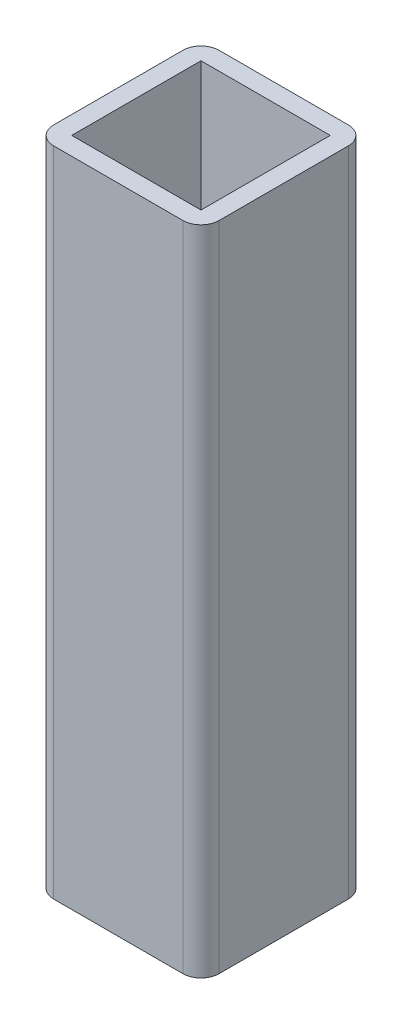
ISO-10303-21;
HEADER;
FILE_DESCRIPTION(('STEP AP214'),'2;1');
FILE_NAME('part.step','',(''),(''),'','','');
FILE_SCHEMA(('AUTOMOTIVE_DESIGN { 1 0 10303 214 1 1 1 1 }'));
ENDSEC;
DATA;
#1=APPLICATION_CONTEXT('core data for automotive mechanical design processes');
#2=APPLICATION_PROTOCOL_DEFINITION('international standard','automotive_design',2000,#1);
#3=PRODUCT_CONTEXT('',#1,'mechanical');
#4=PRODUCT('Part','Part','',(#3));
#5=PRODUCT_RELATED_PRODUCT_CATEGORY('part','',(#4));
#6=PRODUCT_DEFINITION_FORMATION('','',#4);
#7=PRODUCT_DEFINITION_CONTEXT('part definition',#1,'design');
#8=PRODUCT_DEFINITION('design','',#6,#7);
#9=PRODUCT_DEFINITION_SHAPE('','',#8);
#10=(LENGTH_UNIT() NAMED_UNIT(*) SI_UNIT(.MILLI.,.METRE.));
#11=(NAMED_UNIT(*) PLANE_ANGLE_UNIT() SI_UNIT($,.RADIAN.));
#12=(NAMED_UNIT(*) SI_UNIT($,.STERADIAN.) SOLID_ANGLE_UNIT());
#13=UNCERTAINTY_MEASURE_WITH_UNIT(LENGTH_MEASURE(1.E-05),#10,'distance_accuracy_value','');
#14=(GEOMETRIC_REPRESENTATION_CONTEXT(3) GLOBAL_UNCERTAINTY_ASSIGNED_CONTEXT((#13)) GLOBAL_UNIT_ASSIGNED_CONTEXT((#10,
#11,#12)) REPRESENTATION_CONTEXT('',''));
#15=CARTESIAN_POINT('',(0.,0.,0.));
#16=DIRECTION('',(0.,0.,1.));
#17=DIRECTION('',(1.,0.,0.));
#18=AXIS2_PLACEMENT_3D('',#15,#16,#17);
#19=CARTESIAN_POINT('',(22.8,100.91,2.8));
#20=DIRECTION('',(0.,-1.,0.));
#21=DIRECTION('',(0.,0.,-1.));
#22=AXIS2_PLACEMENT_3D('',#19,#20,#21);
#23=CYLINDRICAL_SURFACE('',#22,2.8);
#24=CARTESIAN_POINT('',(22.8,0.,2.8));
#25=DIRECTION('',(0.,1.,0.));
#26=DIRECTION('',(0.,0.,-1.));
#27=AXIS2_PLACEMENT_3D('',#24,#25,#26);
#28=CIRCLE('',#27,2.8);
#29=CARTESIAN_POINT('',(25.6,0.,2.80000000000002));
#30=VERTEX_POINT('',#29);
#31=CARTESIAN_POINT('',(22.8,0.,0.));
#32=VERTEX_POINT('',#31);
#33=EDGE_CURVE('E157',#30,#32,#28,.T.);
#34=ORIENTED_EDGE('',*,*,#33,.T.);
#35=DIRECTION('',(0.,-1.,0.));
#36=VECTOR('',#35,1.);
#37=CARTESIAN_POINT('',(22.8,100.91,0.));
#38=LINE('',#37,#36);
#39=CARTESIAN_POINT('',(22.8,100.91,0.));
#40=VERTEX_POINT('',#39);
#41=EDGE_CURVE('E11',#40,#32,#38,.T.);
#42=ORIENTED_EDGE('',*,*,#41,.F.);
#43=CARTESIAN_POINT('',(22.8,100.91,2.8));
#44=DIRECTION('',(0.,1.,0.));
#45=DIRECTION('',(0.,0.,-1.));
#46=AXIS2_PLACEMENT_3D('',#43,#44,#45);
#47=CIRCLE('',#46,2.8);
#48=CARTESIAN_POINT('',(25.6,100.91,2.80000000000002));
#49=VERTEX_POINT('',#48);
#50=EDGE_CURVE('E158',#49,#40,#47,.T.);
#51=ORIENTED_EDGE('',*,*,#50,.F.);
#52=DIRECTION('',(0.,-1.,0.));
#53=VECTOR('',#52,1.);
#54=CARTESIAN_POINT('',(25.6,100.91,2.80000000000002));
#55=LINE('',#54,#53);
#56=EDGE_CURVE('E176',#49,#30,#55,.T.);
#57=ORIENTED_EDGE('',*,*,#56,.T.);
#58=EDGE_LOOP('',(#34,#42,#51,#57));
#59=FACE_BOUND('',#58,.T.);
#60=ADVANCED_FACE('F32',(#59),#23,.T.);
#61=CARTESIAN_POINT('',(2.80000000000002,100.91,0.));
#62=DIRECTION('',(0.,0.,1.));
#63=DIRECTION('',(1.,0.,0.));
#64=AXIS2_PLACEMENT_3D('',#61,#62,#63);
#65=PLANE('',#64);
#66=DIRECTION('',(-1.,0.,0.));
#67=VECTOR('',#66,1.);
#68=CARTESIAN_POINT('',(2.80000000000002,0.,0.));
#69=LINE('',#68,#67);
#70=CARTESIAN_POINT('',(2.80000000000002,0.,0.));
#71=VERTEX_POINT('',#70);
#72=EDGE_CURVE('E179',#32,#71,#69,.T.);
#73=ORIENTED_EDGE('',*,*,#72,.T.);
#74=DIRECTION('',(0.,-1.,0.));
#75=VECTOR('',#74,1.);
#76=CARTESIAN_POINT('',(2.80000000000002,100.91,0.));
#77=LINE('',#76,#75);
#78=CARTESIAN_POINT('',(2.80000000000002,100.91,0.));
#79=VERTEX_POINT('',#78);
#80=EDGE_CURVE('E39',#79,#71,#77,.T.);
#81=ORIENTED_EDGE('',*,*,#80,.F.);
#82=DIRECTION('',(-1.,0.,0.));
#83=VECTOR('',#82,1.);
#84=CARTESIAN_POINT('',(2.80000000000002,100.91,0.));
#85=LINE('',#84,#83);
#86=EDGE_CURVE('E161',#40,#79,#85,.T.);
#87=ORIENTED_EDGE('',*,*,#86,.F.);
#88=ORIENTED_EDGE('',*,*,#41,.T.);
#89=EDGE_LOOP('',(#73,#81,#87,#88));
#90=FACE_BOUND('',#89,.T.);
#91=ADVANCED_FACE('F234',(#90),#65,.F.);
#92=CARTESIAN_POINT('',(2.8,100.91,2.8));
#93=DIRECTION('',(0.,-1.,0.));
#94=DIRECTION('',(0.,0.,-1.));
#95=AXIS2_PLACEMENT_3D('',#92,#93,#94);
#96=CYLINDRICAL_SURFACE('',#95,2.8);
#97=CARTESIAN_POINT('',(2.8,0.,2.8));
#98=DIRECTION('',(0.,1.,0.));
#99=DIRECTION('',(0.,0.,1.));
#100=AXIS2_PLACEMENT_3D('',#97,#98,#99);
#101=CIRCLE('',#100,2.8);
#102=CARTESIAN_POINT('',(0.,0.,2.80000000000002));
#103=VERTEX_POINT('',#102);
#104=EDGE_CURVE('E181',#71,#103,#101,.T.);
#105=ORIENTED_EDGE('',*,*,#104,.T.);
#106=DIRECTION('',(0.,-1.,0.));
#107=VECTOR('',#106,1.);
#108=CARTESIAN_POINT('',(0.,100.91,2.80000000000002));
#109=LINE('',#108,#107);
#110=CARTESIAN_POINT('',(0.,100.91,2.80000000000002));
#111=VERTEX_POINT('',#110);
#112=EDGE_CURVE('E206',#111,#103,#109,.T.);
#113=ORIENTED_EDGE('',*,*,#112,.F.);
#114=CARTESIAN_POINT('',(2.8,100.91,2.8));
#115=DIRECTION('',(0.,1.,0.));
#116=DIRECTION('',(0.,0.,1.));
#117=AXIS2_PLACEMENT_3D('',#114,#115,#116);
#118=CIRCLE('',#117,2.8);
#119=EDGE_CURVE('E164',#79,#111,#118,.T.);
#120=ORIENTED_EDGE('',*,*,#119,.F.);
#121=ORIENTED_EDGE('',*,*,#80,.T.);
#122=EDGE_LOOP('',(#105,#113,#120,#121));
#123=FACE_BOUND('',#122,.T.);
#124=ADVANCED_FACE('F213',(#123),#96,.T.);
#125=CARTESIAN_POINT('',(0.,100.91,2.80000000000002));
#126=DIRECTION('',(1.,0.,0.));
#127=DIRECTION('',(0.,0.,-1.));
#128=AXIS2_PLACEMENT_3D('',#125,#126,#127);
#129=PLANE('',#128);
#130=DIRECTION('',(0.,0.,1.));
#131=VECTOR('',#130,1.);
#132=CARTESIAN_POINT('',(0.,0.,2.80000000000002));
#133=LINE('',#132,#131);
#134=CARTESIAN_POINT('',(0.,0.,22.8));
#135=VERTEX_POINT('',#134);
#136=EDGE_CURVE('E183',#103,#135,#133,.T.);
#137=ORIENTED_EDGE('',*,*,#136,.T.);
#138=DIRECTION('',(0.,-1.,0.));
#139=VECTOR('',#138,1.);
#140=CARTESIAN_POINT('',(0.,100.91,22.8));
#141=LINE('',#140,#139);
#142=CARTESIAN_POINT('',(0.,100.91,22.8));
#143=VERTEX_POINT('',#142);
#144=EDGE_CURVE('E203',#143,#135,#141,.T.);
#145=ORIENTED_EDGE('',*,*,#144,.F.);
#146=DIRECTION('',(0.,0.,1.));
#147=VECTOR('',#146,1.);
#148=CARTESIAN_POINT('',(0.,100.91,2.80000000000002));
#149=LINE('',#148,#147);
#150=EDGE_CURVE('E166',#111,#143,#149,.T.);
#151=ORIENTED_EDGE('',*,*,#150,.F.);
#152=ORIENTED_EDGE('',*,*,#112,.T.);
#153=EDGE_LOOP('',(#137,#145,#151,#152));
#154=FACE_BOUND('',#153,.T.);
#155=ADVANCED_FACE('F222',(#154),#129,.F.);
#156=CARTESIAN_POINT('',(2.8,100.91,22.8));
#157=DIRECTION('',(0.,-1.,0.));
#158=DIRECTION('',(0.,0.,-1.));
#159=AXIS2_PLACEMENT_3D('',#156,#157,#158);
#160=CYLINDRICAL_SURFACE('',#159,2.8);
#161=CARTESIAN_POINT('',(2.8,0.,22.8));
#162=DIRECTION('',(0.,1.,0.));
#163=DIRECTION('',(0.,0.,1.));
#164=AXIS2_PLACEMENT_3D('',#161,#162,#163);
#165=CIRCLE('',#164,2.8);
#166=CARTESIAN_POINT('',(2.80000000000002,0.,25.6));
#167=VERTEX_POINT('',#166);
#168=EDGE_CURVE('E185',#135,#167,#165,.T.);
#169=ORIENTED_EDGE('',*,*,#168,.T.);
#170=DIRECTION('',(0.,-1.,0.));
#171=VECTOR('',#170,1.);
#172=CARTESIAN_POINT('',(2.80000000000002,100.91,25.6));
#173=LINE('',#172,#171);
#174=CARTESIAN_POINT('',(2.80000000000002,100.91,25.6));
#175=VERTEX_POINT('',#174);
#176=EDGE_CURVE('E200',#175,#167,#173,.T.);
#177=ORIENTED_EDGE('',*,*,#176,.F.);
#178=CARTESIAN_POINT('',(2.8,100.91,22.8));
#179=DIRECTION('',(0.,1.,0.));
#180=DIRECTION('',(0.,0.,1.));
#181=AXIS2_PLACEMENT_3D('',#178,#179,#180);
#182=CIRCLE('',#181,2.8);
#183=EDGE_CURVE('E168',#143,#175,#182,.T.);
#184=ORIENTED_EDGE('',*,*,#183,.F.);
#185=ORIENTED_EDGE('',*,*,#144,.T.);
#186=EDGE_LOOP('',(#169,#177,#184,#185));
#187=FACE_BOUND('',#186,.T.);
#188=ADVANCED_FACE('F226',(#187),#160,.T.);
#189=CARTESIAN_POINT('',(2.80000000000002,100.91,25.6));
#190=DIRECTION('',(0.,0.,-1.));
#191=DIRECTION('',(-1.,0.,0.));
#192=AXIS2_PLACEMENT_3D('',#189,#190,#191);
#193=PLANE('',#192);
#194=DIRECTION('',(1.,0.,0.));
#195=VECTOR('',#194,1.);
#196=CARTESIAN_POINT('',(2.80000000000002,0.,25.6));
#197=LINE('',#196,#195);
#198=CARTESIAN_POINT('',(22.8,0.,25.6));
#199=VERTEX_POINT('',#198);
#200=EDGE_CURVE('E187',#167,#199,#197,.T.);
#201=ORIENTED_EDGE('',*,*,#200,.T.);
#202=DIRECTION('',(0.,-1.,0.));
#203=VECTOR('',#202,1.);
#204=CARTESIAN_POINT('',(22.8,100.91,25.6));
#205=LINE('',#204,#203);
#206=CARTESIAN_POINT('',(22.8,100.91,25.6));
#207=VERTEX_POINT('',#206);
#208=EDGE_CURVE('E197',#207,#199,#205,.T.);
#209=ORIENTED_EDGE('',*,*,#208,.F.);
#210=DIRECTION('',(1.,0.,0.));
#211=VECTOR('',#210,1.);
#212=CARTESIAN_POINT('',(2.80000000000002,100.91,25.6));
#213=LINE('',#212,#211);
#214=EDGE_CURVE('E170',#175,#207,#213,.T.);
#215=ORIENTED_EDGE('',*,*,#214,.F.);
#216=ORIENTED_EDGE('',*,*,#176,.T.);
#217=EDGE_LOOP('',(#201,#209,#215,#216));
#218=FACE_BOUND('',#217,.T.);
#219=ADVANCED_FACE('F247',(#218),#193,.F.);
#220=CARTESIAN_POINT('',(22.8,100.91,22.8));
#221=DIRECTION('',(0.,-1.,0.));
#222=DIRECTION('',(0.,0.,-1.));
#223=AXIS2_PLACEMENT_3D('',#220,#221,#222);
#224=CYLINDRICAL_SURFACE('',#223,2.8);
#225=CARTESIAN_POINT('',(22.8,0.,22.8));
#226=DIRECTION('',(0.,1.,0.));
#227=DIRECTION('',(0.,0.,1.));
#228=AXIS2_PLACEMENT_3D('',#225,#226,#227);
#229=CIRCLE('',#228,2.8);
#230=CARTESIAN_POINT('',(25.6,0.,22.8));
#231=VERTEX_POINT('',#230);
#232=EDGE_CURVE('E189',#199,#231,#229,.T.);
#233=ORIENTED_EDGE('',*,*,#232,.T.);
#234=DIRECTION('',(0.,-1.,0.));
#235=VECTOR('',#234,1.);
#236=CARTESIAN_POINT('',(25.6,100.91,22.8));
#237=LINE('',#236,#235);
#238=CARTESIAN_POINT('',(25.6,100.91,22.8));
#239=VERTEX_POINT('',#238);
#240=EDGE_CURVE('E194',#239,#231,#237,.T.);
#241=ORIENTED_EDGE('',*,*,#240,.F.);
#242=CARTESIAN_POINT('',(22.8,100.91,22.8));
#243=DIRECTION('',(0.,1.,0.));
#244=DIRECTION('',(0.,0.,1.));
#245=AXIS2_PLACEMENT_3D('',#242,#243,#244);
#246=CIRCLE('',#245,2.8);
#247=EDGE_CURVE('E172',#207,#239,#246,.T.);
#248=ORIENTED_EDGE('',*,*,#247,.F.);
#249=ORIENTED_EDGE('',*,*,#208,.T.);
#250=EDGE_LOOP('',(#233,#241,#248,#249));
#251=FACE_BOUND('',#250,.T.);
#252=ADVANCED_FACE('F245',(#251),#224,.T.);
#253=CARTESIAN_POINT('',(25.6,100.91,2.80000000000002));
#254=DIRECTION('',(-1.,0.,0.));
#255=DIRECTION('',(0.,0.,1.));
#256=AXIS2_PLACEMENT_3D('',#253,#254,#255);
#257=PLANE('',#256);
#258=DIRECTION('',(0.,0.,-1.));
#259=VECTOR('',#258,1.);
#260=CARTESIAN_POINT('',(25.6,0.,2.80000000000002));
#261=LINE('',#260,#259);
#262=EDGE_CURVE('E162',#231,#30,#261,.T.);
#263=ORIENTED_EDGE('',*,*,#262,.T.);
#264=ORIENTED_EDGE('',*,*,#56,.F.);
#265=DIRECTION('',(0.,0.,-1.));
#266=VECTOR('',#265,1.);
#267=CARTESIAN_POINT('',(25.6,100.91,2.80000000000002));
#268=LINE('',#267,#266);
#269=EDGE_CURVE('E174',#239,#49,#268,.T.);
#270=ORIENTED_EDGE('',*,*,#269,.F.);
#271=ORIENTED_EDGE('',*,*,#240,.T.);
#272=EDGE_LOOP('',(#263,#264,#270,#271));
#273=FACE_BOUND('',#272,.T.);
#274=ADVANCED_FACE('F240',(#273),#257,.F.);
#275=CARTESIAN_POINT('',(22.8,100.91,2.8));
#276=DIRECTION('',(0.,-1.,0.));
#277=DIRECTION('',(0.,0.,-1.));
#278=AXIS2_PLACEMENT_3D('',#275,#276,#277);
#279=PLANE('',#278);
#280=DIRECTION('',(1.,0.,0.));
#281=VECTOR('',#280,1.);
#282=CARTESIAN_POINT('',(22.8,100.91,2.8));
#283=LINE('',#282,#281);
#284=CARTESIAN_POINT('',(2.8,100.91,2.8));
#285=VERTEX_POINT('',#284);
#286=CARTESIAN_POINT('',(22.8,100.91,2.8));
#287=VERTEX_POINT('',#286);
#288=EDGE_CURVE('E151',#285,#287,#283,.T.);
#289=ORIENTED_EDGE('',*,*,#288,.T.);
#290=DIRECTION('',(0.,0.,1.));
#291=VECTOR('',#290,1.);
#292=CARTESIAN_POINT('',(22.8,100.91,2.8));
#293=LINE('',#292,#291);
#294=CARTESIAN_POINT('',(22.8,100.91,22.8));
#295=VERTEX_POINT('',#294);
#296=EDGE_CURVE('E154',#287,#295,#293,.T.);
#297=ORIENTED_EDGE('',*,*,#296,.T.);
#298=DIRECTION('',(-1.,0.,0.));
#299=VECTOR('',#298,1.);
#300=CARTESIAN_POINT('',(22.8,100.91,22.8));
#301=LINE('',#300,#299);
#302=CARTESIAN_POINT('',(2.8,100.91,22.8));
#303=VERTEX_POINT('',#302);
#304=EDGE_CURVE('E146',#295,#303,#301,.T.);
#305=ORIENTED_EDGE('',*,*,#304,.T.);
#306=DIRECTION('',(0.,0.,-1.));
#307=VECTOR('',#306,1.);
#308=CARTESIAN_POINT('',(2.8,100.91,2.79999999999999));
#309=LINE('',#308,#307);
#310=EDGE_CURVE('E126',#303,#285,#309,.T.);
#311=ORIENTED_EDGE('',*,*,#310,.T.);
#312=EDGE_LOOP('',(#289,#297,#305,#311));
#313=FACE_BOUND('',#312,.T.);
#314=ORIENTED_EDGE('',*,*,#50,.T.);
#315=ORIENTED_EDGE('',*,*,#86,.T.);
#316=ORIENTED_EDGE('',*,*,#119,.T.);
#317=ORIENTED_EDGE('',*,*,#150,.T.);
#318=ORIENTED_EDGE('',*,*,#183,.T.);
#319=ORIENTED_EDGE('',*,*,#214,.T.);
#320=ORIENTED_EDGE('',*,*,#247,.T.);
#321=ORIENTED_EDGE('',*,*,#269,.T.);
#322=EDGE_LOOP('',(#314,#315,#316,#317,#318,#319,#320,#321));
#323=FACE_BOUND('',#322,.T.);
#324=ADVANCED_FACE('F230',(#313,#323),#279,.F.);
#325=CARTESIAN_POINT('',(22.8,0.,2.8));
#326=DIRECTION('',(0.,-1.,0.));
#327=DIRECTION('',(0.,0.,-1.));
#328=AXIS2_PLACEMENT_3D('',#325,#326,#327);
#329=PLANE('',#328);
#330=DIRECTION('',(0.,0.,1.));
#331=VECTOR('',#330,1.);
#332=CARTESIAN_POINT('',(22.8,0.,2.8));
#333=LINE('',#332,#331);
#334=CARTESIAN_POINT('',(22.8,0.,2.8));
#335=VERTEX_POINT('',#334);
#336=CARTESIAN_POINT('',(22.8,0.,22.8));
#337=VERTEX_POINT('',#336);
#338=EDGE_CURVE('E54',#335,#337,#333,.T.);
#339=ORIENTED_EDGE('',*,*,#338,.F.);
#340=DIRECTION('',(1.,0.,0.));
#341=VECTOR('',#340,1.);
#342=CARTESIAN_POINT('',(2.8,0.,2.8));
#343=LINE('',#342,#341);
#344=CARTESIAN_POINT('',(2.8,0.,2.8));
#345=VERTEX_POINT('',#344);
#346=EDGE_CURVE('E139',#345,#335,#343,.T.);
#347=ORIENTED_EDGE('',*,*,#346,.F.);
#348=DIRECTION('',(0.,0.,-1.));
#349=VECTOR('',#348,1.);
#350=CARTESIAN_POINT('',(2.8,0.,2.8));
#351=LINE('',#350,#349);
#352=CARTESIAN_POINT('',(2.8,0.,22.8));
#353=VERTEX_POINT('',#352);
#354=EDGE_CURVE('E123',#353,#345,#351,.T.);
#355=ORIENTED_EDGE('',*,*,#354,.F.);
#356=DIRECTION('',(-1.,0.,0.));
#357=VECTOR('',#356,1.);
#358=CARTESIAN_POINT('',(2.8,0.,22.8));
#359=LINE('',#358,#357);
#360=EDGE_CURVE('E132',#337,#353,#359,.T.);
#361=ORIENTED_EDGE('',*,*,#360,.F.);
#362=EDGE_LOOP('',(#339,#347,#355,#361));
#363=FACE_BOUND('',#362,.T.);
#364=ORIENTED_EDGE('',*,*,#33,.F.);
#365=ORIENTED_EDGE('',*,*,#262,.F.);
#366=ORIENTED_EDGE('',*,*,#232,.F.);
#367=ORIENTED_EDGE('',*,*,#200,.F.);
#368=ORIENTED_EDGE('',*,*,#168,.F.);
#369=ORIENTED_EDGE('',*,*,#136,.F.);
#370=ORIENTED_EDGE('',*,*,#104,.F.);
#371=ORIENTED_EDGE('',*,*,#72,.F.);
#372=EDGE_LOOP('',(#364,#365,#366,#367,#368,#369,#370,#371));
#373=FACE_BOUND('',#372,.T.);
#374=ADVANCED_FACE('F136',(#363,#373),#329,.T.);
#375=CARTESIAN_POINT('',(22.8,1040.5,2.8));
#376=DIRECTION('',(1.,0.,0.));
#377=DIRECTION('',(0.,0.,-1.));
#378=AXIS2_PLACEMENT_3D('',#375,#376,#377);
#379=PLANE('',#378);
#380=DIRECTION('',(0.,-1.,0.));
#381=VECTOR('',#380,1.);
#382=CARTESIAN_POINT('',(22.8,1040.5,2.8));
#383=LINE('',#382,#381);
#384=EDGE_CURVE('E144',#287,#335,#383,.T.);
#385=ORIENTED_EDGE('',*,*,#384,.T.);
#386=ORIENTED_EDGE('',*,*,#338,.T.);
#387=DIRECTION('',(0.,-1.,0.));
#388=VECTOR('',#387,1.);
#389=CARTESIAN_POINT('',(22.8,1040.5,22.8));
#390=LINE('',#389,#388);
#391=EDGE_CURVE('E129',#295,#337,#390,.T.);
#392=ORIENTED_EDGE('',*,*,#391,.F.);
#393=ORIENTED_EDGE('',*,*,#296,.F.);
#394=EDGE_LOOP('',(#385,#386,#392,#393));
#395=FACE_BOUND('',#394,.T.);
#396=ADVANCED_FACE('F310',(#395),#379,.F.);
#397=CARTESIAN_POINT('',(2.8,1040.5,2.8));
#398=DIRECTION('',(0.,0.,-1.));
#399=DIRECTION('',(-1.,0.,0.));
#400=AXIS2_PLACEMENT_3D('',#397,#398,#399);
#401=PLANE('',#400);
#402=DIRECTION('',(0.,-1.,0.));
#403=VECTOR('',#402,1.);
#404=CARTESIAN_POINT('',(2.8,1040.5,2.8));
#405=LINE('',#404,#403);
#406=EDGE_CURVE('E128',#285,#345,#405,.T.);
#407=ORIENTED_EDGE('',*,*,#406,.T.);
#408=ORIENTED_EDGE('',*,*,#346,.T.);
#409=ORIENTED_EDGE('',*,*,#384,.F.);
#410=ORIENTED_EDGE('',*,*,#288,.F.);
#411=EDGE_LOOP('',(#407,#408,#409,#410));
#412=FACE_BOUND('',#411,.T.);
#413=ADVANCED_FACE('F319',(#412),#401,.F.);
#414=CARTESIAN_POINT('',(2.8,1040.5,2.8));
#415=DIRECTION('',(-1.,0.,0.));
#416=DIRECTION('',(0.,0.,1.));
#417=AXIS2_PLACEMENT_3D('',#414,#415,#416);
#418=PLANE('',#417);
#419=DIRECTION('',(0.,-1.,0.));
#420=VECTOR('',#419,1.);
#421=CARTESIAN_POINT('',(2.8,1040.5,22.8));
#422=LINE('',#421,#420);
#423=EDGE_CURVE('E46',#303,#353,#422,.T.);
#424=ORIENTED_EDGE('',*,*,#423,.T.);
#425=ORIENTED_EDGE('',*,*,#354,.T.);
#426=ORIENTED_EDGE('',*,*,#406,.F.);
#427=ORIENTED_EDGE('',*,*,#310,.F.);
#428=EDGE_LOOP('',(#424,#425,#426,#427));
#429=FACE_BOUND('',#428,.T.);
#430=ADVANCED_FACE('F120',(#429),#418,.F.);
#431=CARTESIAN_POINT('',(2.8,1040.5,22.8));
#432=DIRECTION('',(0.,0.,1.));
#433=DIRECTION('',(1.,0.,0.));
#434=AXIS2_PLACEMENT_3D('',#431,#432,#433);
#435=PLANE('',#434);
#436=ORIENTED_EDGE('',*,*,#391,.T.);
#437=ORIENTED_EDGE('',*,*,#360,.T.);
#438=ORIENTED_EDGE('',*,*,#423,.F.);
#439=ORIENTED_EDGE('',*,*,#304,.F.);
#440=EDGE_LOOP('',(#436,#437,#438,#439));
#441=FACE_BOUND('',#440,.T.);
#442=ADVANCED_FACE('F133',(#441),#435,.F.);
#443=CLOSED_SHELL('',(#60,#91,#124,#155,#188,#219,#252,#274,#324,#374,#396,#413,#430,#442));
#444=MANIFOLD_SOLID_BREP('B2',#443);
#445=ADVANCED_BREP_SHAPE_REPRESENTATION('',(#18,#444),#14);
#446=SHAPE_DEFINITION_REPRESENTATION(#9,#445);
ENDSEC;
END-ISO-10303-21;
